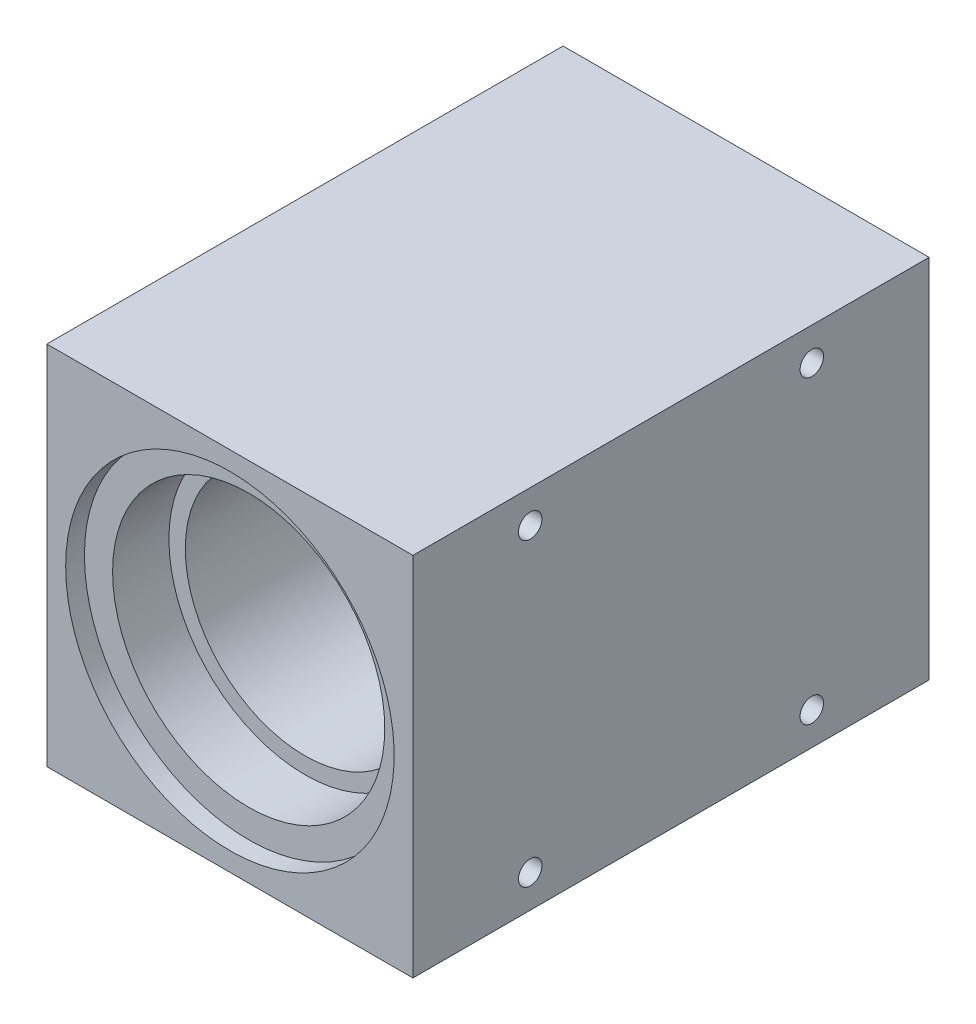
ISO-10303-21;
HEADER;
FILE_DESCRIPTION(('STEP AP214'),'2;1');
FILE_NAME('part.step','',(''),(''),'','','');
FILE_SCHEMA(('AUTOMOTIVE_DESIGN { 1 0 10303 214 1 1 1 1 }'));
ENDSEC;
DATA;
#1=APPLICATION_CONTEXT('core data for automotive mechanical design processes');
#2=APPLICATION_PROTOCOL_DEFINITION('international standard','automotive_design',2000,#1);
#3=PRODUCT_CONTEXT('',#1,'mechanical');
#4=PRODUCT('Part','Part','',(#3));
#5=PRODUCT_RELATED_PRODUCT_CATEGORY('part','',(#4));
#6=PRODUCT_DEFINITION_FORMATION('','',#4);
#7=PRODUCT_DEFINITION_CONTEXT('part definition',#1,'design');
#8=PRODUCT_DEFINITION('design','',#6,#7);
#9=PRODUCT_DEFINITION_SHAPE('','',#8);
#10=(LENGTH_UNIT() NAMED_UNIT(*) SI_UNIT(.MILLI.,.METRE.));
#11=(NAMED_UNIT(*) PLANE_ANGLE_UNIT() SI_UNIT($,.RADIAN.));
#12=(NAMED_UNIT(*) SI_UNIT($,.STERADIAN.) SOLID_ANGLE_UNIT());
#13=UNCERTAINTY_MEASURE_WITH_UNIT(LENGTH_MEASURE(1.E-05),#10,'distance_accuracy_value','');
#14=(GEOMETRIC_REPRESENTATION_CONTEXT(3) GLOBAL_UNCERTAINTY_ASSIGNED_CONTEXT((#13)) GLOBAL_UNIT_ASSIGNED_CONTEXT((#10,
#11,#12)) REPRESENTATION_CONTEXT('',''));
#15=CARTESIAN_POINT('',(0.,0.,0.));
#16=DIRECTION('',(0.,0.,1.));
#17=DIRECTION('',(1.,0.,0.));
#18=AXIS2_PLACEMENT_3D('',#15,#16,#17);
#19=CARTESIAN_POINT('',(0.,0.,110.));
#20=DIRECTION('',(0.,0.,-1.));
#21=DIRECTION('',(-1.,0.,0.));
#22=AXIS2_PLACEMENT_3D('',#19,#20,#21);
#23=CYLINDRICAL_SURFACE('',#22,25.5);
#24=CARTESIAN_POINT('',(0.,0.,16.));
#25=DIRECTION('',(0.,0.,-1.));
#26=DIRECTION('',(-1.,0.,0.));
#27=AXIS2_PLACEMENT_3D('',#24,#25,#26);
#28=CIRCLE('',#27,25.5);
#29=CARTESIAN_POINT('',(-25.5,0.,16.));
#30=VERTEX_POINT('',#29);
#31=EDGE_CURVE('E104',#30,#30,#28,.T.);
#32=ORIENTED_EDGE('',*,*,#31,.T.);
#33=EDGE_LOOP('',(#32));
#34=FACE_BOUND('',#33,.T.);
#35=CARTESIAN_POINT('',(0.,0.,94.));
#36=DIRECTION('',(0.,0.,1.));
#37=DIRECTION('',(1.,0.,0.));
#38=AXIS2_PLACEMENT_3D('',#35,#36,#37);
#39=CIRCLE('',#38,25.5);
#40=CARTESIAN_POINT('',(25.5,0.,94.));
#41=VERTEX_POINT('',#40);
#42=EDGE_CURVE('E38',#41,#41,#39,.T.);
#43=ORIENTED_EDGE('',*,*,#42,.T.);
#44=EDGE_LOOP('',(#43));
#45=FACE_BOUND('',#44,.T.);
#46=ADVANCED_FACE('F34',(#34,#45),#23,.F.);
#47=CARTESIAN_POINT('',(0.,0.,110.));
#48=DIRECTION('',(0.,0.,1.));
#49=DIRECTION('',(1.,0.,0.));
#50=AXIS2_PLACEMENT_3D('',#47,#48,#49);
#51=PLANE('',#50);
#52=CARTESIAN_POINT('',(0.,0.,110.));
#53=DIRECTION('',(0.,0.,-1.));
#54=DIRECTION('',(-1.,0.,0.));
#55=AXIS2_PLACEMENT_3D('',#52,#53,#54);
#56=CIRCLE('',#55,35.);
#57=CARTESIAN_POINT('',(-35.,0.,110.));
#58=VERTEX_POINT('',#57);
#59=EDGE_CURVE('E135',#58,#58,#56,.T.);
#60=ORIENTED_EDGE('',*,*,#59,.T.);
#61=EDGE_LOOP('',(#60));
#62=FACE_BOUND('',#61,.T.);
#63=DIRECTION('',(0.,1.,0.));
#64=VECTOR('',#63,1.);
#65=CARTESIAN_POINT('',(39.,39.,110.));
#66=LINE('',#65,#64);
#67=CARTESIAN_POINT('',(39.,-39.,110.));
#68=VERTEX_POINT('',#67);
#69=CARTESIAN_POINT('',(39.,39.,110.));
#70=VERTEX_POINT('',#69);
#71=EDGE_CURVE('E88',#68,#70,#66,.T.);
#72=ORIENTED_EDGE('',*,*,#71,.T.);
#73=DIRECTION('',(-1.,0.,0.));
#74=VECTOR('',#73,1.);
#75=CARTESIAN_POINT('',(-39.,39.,110.));
#76=LINE('',#75,#74);
#77=CARTESIAN_POINT('',(-39.,39.,110.));
#78=VERTEX_POINT('',#77);
#79=EDGE_CURVE('E83',#70,#78,#76,.T.);
#80=ORIENTED_EDGE('',*,*,#79,.T.);
#81=DIRECTION('',(0.,-1.,0.));
#82=VECTOR('',#81,1.);
#83=CARTESIAN_POINT('',(-39.,39.,110.));
#84=LINE('',#83,#82);
#85=CARTESIAN_POINT('',(-39.,-39.,110.));
#86=VERTEX_POINT('',#85);
#87=EDGE_CURVE('E86',#78,#86,#84,.T.);
#88=ORIENTED_EDGE('',*,*,#87,.T.);
#89=DIRECTION('',(1.,0.,0.));
#90=VECTOR('',#89,1.);
#91=CARTESIAN_POINT('',(-39.,-39.,110.));
#92=LINE('',#91,#90);
#93=EDGE_CURVE('E53',#86,#68,#92,.T.);
#94=ORIENTED_EDGE('',*,*,#93,.T.);
#95=EDGE_LOOP('',(#72,#80,#88,#94));
#96=FACE_BOUND('',#95,.T.);
#97=ADVANCED_FACE('F84',(#62,#96),#51,.T.);
#98=CARTESIAN_POINT('',(0.,0.,0.));
#99=DIRECTION('',(0.,0.,1.));
#100=DIRECTION('',(1.,0.,0.));
#101=AXIS2_PLACEMENT_3D('',#98,#99,#100);
#102=PLANE('',#101);
#103=CARTESIAN_POINT('',(0.,0.,0.));
#104=DIRECTION('',(0.,0.,1.));
#105=DIRECTION('',(1.,0.,0.));
#106=AXIS2_PLACEMENT_3D('',#103,#104,#105);
#107=CIRCLE('',#106,35.);
#108=CARTESIAN_POINT('',(35.,0.,0.));
#109=VERTEX_POINT('',#108);
#110=EDGE_CURVE('E126',#109,#109,#107,.T.);
#111=ORIENTED_EDGE('',*,*,#110,.T.);
#112=EDGE_LOOP('',(#111));
#113=FACE_BOUND('',#112,.T.);
#114=DIRECTION('',(0.,1.,0.));
#115=VECTOR('',#114,1.);
#116=CARTESIAN_POINT('',(39.,39.,0.));
#117=LINE('',#116,#115);
#118=CARTESIAN_POINT('',(39.,-39.,0.));
#119=VERTEX_POINT('',#118);
#120=CARTESIAN_POINT('',(39.,39.,0.));
#121=VERTEX_POINT('',#120);
#122=EDGE_CURVE('E101',#119,#121,#117,.T.);
#123=ORIENTED_EDGE('',*,*,#122,.F.);
#124=DIRECTION('',(1.,0.,0.));
#125=VECTOR('',#124,1.);
#126=CARTESIAN_POINT('',(-39.,-39.,0.));
#127=LINE('',#126,#125);
#128=CARTESIAN_POINT('',(-39.,-39.,0.));
#129=VERTEX_POINT('',#128);
#130=EDGE_CURVE('E76',#129,#119,#127,.T.);
#131=ORIENTED_EDGE('',*,*,#130,.F.);
#132=DIRECTION('',(0.,-1.,0.));
#133=VECTOR('',#132,1.);
#134=CARTESIAN_POINT('',(-39.,39.,0.));
#135=LINE('',#134,#133);
#136=CARTESIAN_POINT('',(-39.,39.,0.));
#137=VERTEX_POINT('',#136);
#138=EDGE_CURVE('E70',#137,#129,#135,.T.);
#139=ORIENTED_EDGE('',*,*,#138,.F.);
#140=DIRECTION('',(-1.,0.,0.));
#141=VECTOR('',#140,1.);
#142=CARTESIAN_POINT('',(-39.,39.,0.));
#143=LINE('',#142,#141);
#144=EDGE_CURVE('E92',#121,#137,#143,.T.);
#145=ORIENTED_EDGE('',*,*,#144,.F.);
#146=EDGE_LOOP('',(#123,#131,#139,#145));
#147=FACE_BOUND('',#146,.T.);
#148=ADVANCED_FACE('F177',(#113,#147),#102,.F.);
#149=CARTESIAN_POINT('',(39.,39.,110.));
#150=DIRECTION('',(-1.,0.,0.));
#151=DIRECTION('',(0.,-1.,0.));
#152=AXIS2_PLACEMENT_3D('',#149,#150,#151);
#153=PLANE('',#152);
#154=CARTESIAN_POINT('',(39.,-32.,85.));
#155=DIRECTION('',(1.,0.,0.));
#156=DIRECTION('',(0.,1.,0.));
#157=AXIS2_PLACEMENT_3D('',#154,#155,#156);
#158=CIRCLE('',#157,2.5);
#159=CARTESIAN_POINT('',(39.,-29.5,85.));
#160=VERTEX_POINT('',#159);
#161=EDGE_CURVE('E147',#160,#160,#158,.T.);
#162=ORIENTED_EDGE('',*,*,#161,.F.);
#163=EDGE_LOOP('',(#162));
#164=FACE_BOUND('',#163,.T.);
#165=CARTESIAN_POINT('',(39.,-32.,25.));
#166=DIRECTION('',(1.,0.,0.));
#167=DIRECTION('',(0.,1.,0.));
#168=AXIS2_PLACEMENT_3D('',#165,#166,#167);
#169=CIRCLE('',#168,2.5);
#170=CARTESIAN_POINT('',(39.,-29.5,25.));
#171=VERTEX_POINT('',#170);
#172=EDGE_CURVE('E153',#171,#171,#169,.T.);
#173=ORIENTED_EDGE('',*,*,#172,.F.);
#174=EDGE_LOOP('',(#173));
#175=FACE_BOUND('',#174,.T.);
#176=CARTESIAN_POINT('',(39.,32.,25.));
#177=DIRECTION('',(1.,0.,0.));
#178=DIRECTION('',(0.,1.,0.));
#179=AXIS2_PLACEMENT_3D('',#176,#177,#178);
#180=CIRCLE('',#179,2.5);
#181=CARTESIAN_POINT('',(39.,34.5,25.));
#182=VERTEX_POINT('',#181);
#183=EDGE_CURVE('E159',#182,#182,#180,.T.);
#184=ORIENTED_EDGE('',*,*,#183,.F.);
#185=EDGE_LOOP('',(#184));
#186=FACE_BOUND('',#185,.T.);
#187=CARTESIAN_POINT('',(39.,32.,85.));
#188=DIRECTION('',(1.,0.,0.));
#189=DIRECTION('',(0.,1.,0.));
#190=AXIS2_PLACEMENT_3D('',#187,#188,#189);
#191=CIRCLE('',#190,2.5);
#192=CARTESIAN_POINT('',(39.,34.5,85.));
#193=VERTEX_POINT('',#192);
#194=EDGE_CURVE('E141',#193,#193,#191,.T.);
#195=ORIENTED_EDGE('',*,*,#194,.F.);
#196=EDGE_LOOP('',(#195));
#197=FACE_BOUND('',#196,.T.);
#198=ORIENTED_EDGE('',*,*,#122,.T.);
#199=DIRECTION('',(0.,0.,-1.));
#200=VECTOR('',#199,1.);
#201=CARTESIAN_POINT('',(39.,39.,110.));
#202=LINE('',#201,#200);
#203=EDGE_CURVE('E11',#70,#121,#202,.T.);
#204=ORIENTED_EDGE('',*,*,#203,.F.);
#205=ORIENTED_EDGE('',*,*,#71,.F.);
#206=DIRECTION('',(0.,0.,-1.));
#207=VECTOR('',#206,1.);
#208=CARTESIAN_POINT('',(39.,-39.,110.));
#209=LINE('',#208,#207);
#210=EDGE_CURVE('E97',#68,#119,#209,.T.);
#211=ORIENTED_EDGE('',*,*,#210,.T.);
#212=EDGE_LOOP('',(#198,#204,#205,#211));
#213=FACE_BOUND('',#212,.T.);
#214=ADVANCED_FACE('F36',(#164,#175,#186,#197,#213),#153,.F.);
#215=CARTESIAN_POINT('',(-39.,39.,110.));
#216=DIRECTION('',(0.,-1.,0.));
#217=DIRECTION('',(0.,0.,-1.));
#218=AXIS2_PLACEMENT_3D('',#215,#216,#217);
#219=PLANE('',#218);
#220=ORIENTED_EDGE('',*,*,#144,.T.);
#221=DIRECTION('',(0.,0.,-1.));
#222=VECTOR('',#221,1.);
#223=CARTESIAN_POINT('',(-39.,39.,110.));
#224=LINE('',#223,#222);
#225=EDGE_CURVE('E44',#78,#137,#224,.T.);
#226=ORIENTED_EDGE('',*,*,#225,.F.);
#227=ORIENTED_EDGE('',*,*,#79,.F.);
#228=ORIENTED_EDGE('',*,*,#203,.T.);
#229=EDGE_LOOP('',(#220,#226,#227,#228));
#230=FACE_BOUND('',#229,.T.);
#231=ADVANCED_FACE('F91',(#230),#219,.F.);
#232=CARTESIAN_POINT('',(-39.,39.,110.));
#233=DIRECTION('',(1.,0.,0.));
#234=DIRECTION('',(0.,1.,0.));
#235=AXIS2_PLACEMENT_3D('',#232,#233,#234);
#236=PLANE('',#235);
#237=CARTESIAN_POINT('',(-39.,-32.,85.));
#238=DIRECTION('',(1.,0.,0.));
#239=DIRECTION('',(0.,1.,0.));
#240=AXIS2_PLACEMENT_3D('',#237,#238,#239);
#241=CIRCLE('',#240,2.5);
#242=CARTESIAN_POINT('',(-39.,-29.5,85.));
#243=VERTEX_POINT('',#242);
#244=EDGE_CURVE('E150',#243,#243,#241,.T.);
#245=ORIENTED_EDGE('',*,*,#244,.T.);
#246=EDGE_LOOP('',(#245));
#247=FACE_BOUND('',#246,.T.);
#248=CARTESIAN_POINT('',(-39.,-32.,25.));
#249=DIRECTION('',(1.,0.,0.));
#250=DIRECTION('',(0.,1.,0.));
#251=AXIS2_PLACEMENT_3D('',#248,#249,#250);
#252=CIRCLE('',#251,2.5);
#253=CARTESIAN_POINT('',(-39.,-29.5,25.));
#254=VERTEX_POINT('',#253);
#255=EDGE_CURVE('E156',#254,#254,#252,.T.);
#256=ORIENTED_EDGE('',*,*,#255,.T.);
#257=EDGE_LOOP('',(#256));
#258=FACE_BOUND('',#257,.T.);
#259=CARTESIAN_POINT('',(-39.,32.,25.));
#260=DIRECTION('',(1.,0.,0.));
#261=DIRECTION('',(0.,1.,0.));
#262=AXIS2_PLACEMENT_3D('',#259,#260,#261);
#263=CIRCLE('',#262,2.5);
#264=CARTESIAN_POINT('',(-39.,34.5,25.));
#265=VERTEX_POINT('',#264);
#266=EDGE_CURVE('E144',#265,#265,#263,.T.);
#267=ORIENTED_EDGE('',*,*,#266,.T.);
#268=EDGE_LOOP('',(#267));
#269=FACE_BOUND('',#268,.T.);
#270=CARTESIAN_POINT('',(-39.,32.,85.));
#271=DIRECTION('',(1.,0.,0.));
#272=DIRECTION('',(0.,1.,0.));
#273=AXIS2_PLACEMENT_3D('',#270,#271,#272);
#274=CIRCLE('',#273,2.5);
#275=CARTESIAN_POINT('',(-39.,34.5,85.));
#276=VERTEX_POINT('',#275);
#277=EDGE_CURVE('E138',#276,#276,#274,.T.);
#278=ORIENTED_EDGE('',*,*,#277,.T.);
#279=EDGE_LOOP('',(#278));
#280=FACE_BOUND('',#279,.T.);
#281=ORIENTED_EDGE('',*,*,#138,.T.);
#282=DIRECTION('',(0.,0.,-1.));
#283=VECTOR('',#282,1.);
#284=CARTESIAN_POINT('',(-39.,-39.,110.));
#285=LINE('',#284,#283);
#286=EDGE_CURVE('E93',#86,#129,#285,.T.);
#287=ORIENTED_EDGE('',*,*,#286,.F.);
#288=ORIENTED_EDGE('',*,*,#87,.F.);
#289=ORIENTED_EDGE('',*,*,#225,.T.);
#290=EDGE_LOOP('',(#281,#287,#288,#289));
#291=FACE_BOUND('',#290,.T.);
#292=ADVANCED_FACE('F95',(#247,#258,#269,#280,#291),#236,.F.);
#293=CARTESIAN_POINT('',(-39.,-39.,110.));
#294=DIRECTION('',(0.,1.,0.));
#295=DIRECTION('',(0.,0.,1.));
#296=AXIS2_PLACEMENT_3D('',#293,#294,#295);
#297=PLANE('',#296);
#298=ORIENTED_EDGE('',*,*,#130,.T.);
#299=ORIENTED_EDGE('',*,*,#210,.F.);
#300=ORIENTED_EDGE('',*,*,#93,.F.);
#301=ORIENTED_EDGE('',*,*,#286,.T.);
#302=EDGE_LOOP('',(#298,#299,#300,#301));
#303=FACE_BOUND('',#302,.T.);
#304=ADVANCED_FACE('F202',(#303),#297,.F.);
#305=CARTESIAN_POINT('',(0.,0.,16.));
#306=DIRECTION('',(0.,0.,-1.));
#307=DIRECTION('',(-1.,0.,0.));
#308=AXIS2_PLACEMENT_3D('',#305,#306,#307);
#309=CYLINDRICAL_SURFACE('',#308,29.);
#310=CARTESIAN_POINT('',(0.,0.,16.));
#311=DIRECTION('',(0.,0.,-1.));
#312=DIRECTION('',(-1.,0.,0.));
#313=AXIS2_PLACEMENT_3D('',#310,#311,#312);
#314=CIRCLE('',#313,29.);
#315=CARTESIAN_POINT('',(-29.,0.,16.));
#316=VERTEX_POINT('',#315);
#317=EDGE_CURVE('E110',#316,#316,#314,.T.);
#318=ORIENTED_EDGE('',*,*,#317,.F.);
#319=EDGE_LOOP('',(#318));
#320=FACE_BOUND('',#319,.T.);
#321=CARTESIAN_POINT('',(0.,0.,4.));
#322=DIRECTION('',(0.,0.,1.));
#323=DIRECTION('',(1.,0.,0.));
#324=AXIS2_PLACEMENT_3D('',#321,#322,#323);
#325=CIRCLE('',#324,29.);
#326=CARTESIAN_POINT('',(29.,0.,4.));
#327=VERTEX_POINT('',#326);
#328=EDGE_CURVE('E122',#327,#327,#325,.F.);
#329=ORIENTED_EDGE('',*,*,#328,.T.);
#330=EDGE_LOOP('',(#329));
#331=FACE_BOUND('',#330,.T.);
#332=ADVANCED_FACE('F198',(#320,#331),#309,.F.);
#333=CARTESIAN_POINT('',(0.,0.,16.));
#334=DIRECTION('',(0.,0.,-1.));
#335=DIRECTION('',(-1.,0.,0.));
#336=AXIS2_PLACEMENT_3D('',#333,#334,#335);
#337=PLANE('',#336);
#338=ORIENTED_EDGE('',*,*,#31,.F.);
#339=EDGE_LOOP('',(#338));
#340=FACE_BOUND('',#339,.T.);
#341=ORIENTED_EDGE('',*,*,#317,.T.);
#342=EDGE_LOOP('',(#341));
#343=FACE_BOUND('',#342,.T.);
#344=ADVANCED_FACE('F201',(#340,#343),#337,.T.);
#345=CARTESIAN_POINT('',(0.,0.,94.));
#346=DIRECTION('',(0.,0.,1.));
#347=DIRECTION('',(1.,0.,0.));
#348=AXIS2_PLACEMENT_3D('',#345,#346,#347);
#349=CYLINDRICAL_SURFACE('',#348,29.);
#350=CARTESIAN_POINT('',(0.,0.,94.));
#351=DIRECTION('',(0.,0.,1.));
#352=DIRECTION('',(1.,0.,0.));
#353=AXIS2_PLACEMENT_3D('',#350,#351,#352);
#354=CIRCLE('',#353,29.);
#355=CARTESIAN_POINT('',(29.,0.,94.));
#356=VERTEX_POINT('',#355);
#357=EDGE_CURVE('E118',#356,#356,#354,.T.);
#358=ORIENTED_EDGE('',*,*,#357,.F.);
#359=EDGE_LOOP('',(#358));
#360=FACE_BOUND('',#359,.T.);
#361=CARTESIAN_POINT('',(0.,0.,106.));
#362=DIRECTION('',(0.,0.,-1.));
#363=DIRECTION('',(-1.,0.,0.));
#364=AXIS2_PLACEMENT_3D('',#361,#362,#363);
#365=CIRCLE('',#364,29.);
#366=CARTESIAN_POINT('',(-29.,0.,106.));
#367=VERTEX_POINT('',#366);
#368=EDGE_CURVE('E129',#367,#367,#365,.F.);
#369=ORIENTED_EDGE('',*,*,#368,.T.);
#370=EDGE_LOOP('',(#369));
#371=FACE_BOUND('',#370,.T.);
#372=ADVANCED_FACE('F206',(#360,#371),#349,.F.);
#373=CARTESIAN_POINT('',(0.,0.,94.));
#374=DIRECTION('',(0.,0.,1.));
#375=DIRECTION('',(1.,0.,0.));
#376=AXIS2_PLACEMENT_3D('',#373,#374,#375);
#377=PLANE('',#376);
#378=ORIENTED_EDGE('',*,*,#42,.F.);
#379=EDGE_LOOP('',(#378));
#380=FACE_BOUND('',#379,.T.);
#381=ORIENTED_EDGE('',*,*,#357,.T.);
#382=EDGE_LOOP('',(#381));
#383=FACE_BOUND('',#382,.T.);
#384=ADVANCED_FACE('F210',(#380,#383),#377,.T.);
#385=CARTESIAN_POINT('',(0.,0.,4.));
#386=DIRECTION('',(0.,0.,1.));
#387=DIRECTION('',(1.,0.,0.));
#388=AXIS2_PLACEMENT_3D('',#385,#386,#387);
#389=PLANE('',#388);
#390=CARTESIAN_POINT('',(0.,0.,4.));
#391=DIRECTION('',(0.,0.,1.));
#392=DIRECTION('',(1.,0.,0.));
#393=AXIS2_PLACEMENT_3D('',#390,#391,#392);
#394=CIRCLE('',#393,35.);
#395=CARTESIAN_POINT('',(35.,0.,4.));
#396=VERTEX_POINT('',#395);
#397=EDGE_CURVE('E125',#396,#396,#394,.T.);
#398=ORIENTED_EDGE('',*,*,#397,.F.);
#399=EDGE_LOOP('',(#398));
#400=FACE_BOUND('',#399,.T.);
#401=ORIENTED_EDGE('',*,*,#328,.F.);
#402=EDGE_LOOP('',(#401));
#403=FACE_BOUND('',#402,.T.);
#404=ADVANCED_FACE('F214',(#400,#403),#389,.F.);
#405=CARTESIAN_POINT('',(0.,0.,4.));
#406=DIRECTION('',(0.,0.,-1.));
#407=DIRECTION('',(-1.,0.,0.));
#408=AXIS2_PLACEMENT_3D('',#405,#406,#407);
#409=CYLINDRICAL_SURFACE('',#408,35.);
#410=ORIENTED_EDGE('',*,*,#397,.T.);
#411=EDGE_LOOP('',(#410));
#412=FACE_BOUND('',#411,.T.);
#413=ORIENTED_EDGE('',*,*,#110,.F.);
#414=EDGE_LOOP('',(#413));
#415=FACE_BOUND('',#414,.T.);
#416=ADVANCED_FACE('F216',(#412,#415),#409,.F.);
#417=CARTESIAN_POINT('',(0.,0.,106.));
#418=DIRECTION('',(0.,0.,-1.));
#419=DIRECTION('',(-1.,0.,0.));
#420=AXIS2_PLACEMENT_3D('',#417,#418,#419);
#421=PLANE('',#420);
#422=CARTESIAN_POINT('',(0.,0.,106.));
#423=DIRECTION('',(0.,0.,-1.));
#424=DIRECTION('',(-1.,0.,0.));
#425=AXIS2_PLACEMENT_3D('',#422,#423,#424);
#426=CIRCLE('',#425,35.);
#427=CARTESIAN_POINT('',(-35.,0.,106.));
#428=VERTEX_POINT('',#427);
#429=EDGE_CURVE('E134',#428,#428,#426,.T.);
#430=ORIENTED_EDGE('',*,*,#429,.F.);
#431=EDGE_LOOP('',(#430));
#432=FACE_BOUND('',#431,.T.);
#433=ORIENTED_EDGE('',*,*,#368,.F.);
#434=EDGE_LOOP('',(#433));
#435=FACE_BOUND('',#434,.T.);
#436=ADVANCED_FACE('F219',(#432,#435),#421,.F.);
#437=CARTESIAN_POINT('',(0.,0.,106.));
#438=DIRECTION('',(0.,0.,1.));
#439=DIRECTION('',(1.,0.,0.));
#440=AXIS2_PLACEMENT_3D('',#437,#438,#439);
#441=CYLINDRICAL_SURFACE('',#440,35.);
#442=ORIENTED_EDGE('',*,*,#429,.T.);
#443=EDGE_LOOP('',(#442));
#444=FACE_BOUND('',#443,.T.);
#445=ORIENTED_EDGE('',*,*,#59,.F.);
#446=EDGE_LOOP('',(#445));
#447=FACE_BOUND('',#446,.T.);
#448=ADVANCED_FACE('F224',(#444,#447),#441,.F.);
#449=CARTESIAN_POINT('',(-39.,32.,85.));
#450=DIRECTION('',(1.,0.,0.));
#451=DIRECTION('',(0.,1.,0.));
#452=AXIS2_PLACEMENT_3D('',#449,#450,#451);
#453=CYLINDRICAL_SURFACE('',#452,2.5);
#454=ORIENTED_EDGE('',*,*,#277,.F.);
#455=EDGE_LOOP('',(#454));
#456=FACE_BOUND('',#455,.T.);
#457=ORIENTED_EDGE('',*,*,#194,.T.);
#458=EDGE_LOOP('',(#457));
#459=FACE_BOUND('',#458,.T.);
#460=ADVANCED_FACE('F171',(#456,#459),#453,.F.);
#461=CARTESIAN_POINT('',(-39.,32.,25.));
#462=DIRECTION('',(1.,0.,0.));
#463=DIRECTION('',(0.,1.,0.));
#464=AXIS2_PLACEMENT_3D('',#461,#462,#463);
#465=CYLINDRICAL_SURFACE('',#464,2.5);
#466=ORIENTED_EDGE('',*,*,#266,.F.);
#467=EDGE_LOOP('',(#466));
#468=FACE_BOUND('',#467,.T.);
#469=ORIENTED_EDGE('',*,*,#183,.T.);
#470=EDGE_LOOP('',(#469));
#471=FACE_BOUND('',#470,.T.);
#472=ADVANCED_FACE('F167',(#468,#471),#465,.F.);
#473=CARTESIAN_POINT('',(-39.,-32.,25.));
#474=DIRECTION('',(1.,0.,0.));
#475=DIRECTION('',(0.,1.,0.));
#476=AXIS2_PLACEMENT_3D('',#473,#474,#475);
#477=CYLINDRICAL_SURFACE('',#476,2.5);
#478=ORIENTED_EDGE('',*,*,#255,.F.);
#479=EDGE_LOOP('',(#478));
#480=FACE_BOUND('',#479,.T.);
#481=ORIENTED_EDGE('',*,*,#172,.T.);
#482=EDGE_LOOP('',(#481));
#483=FACE_BOUND('',#482,.T.);
#484=ADVANCED_FACE('F170',(#480,#483),#477,.F.);
#485=CARTESIAN_POINT('',(-39.,-32.,85.));
#486=DIRECTION('',(1.,0.,0.));
#487=DIRECTION('',(0.,1.,0.));
#488=AXIS2_PLACEMENT_3D('',#485,#486,#487);
#489=CYLINDRICAL_SURFACE('',#488,2.5);
#490=ORIENTED_EDGE('',*,*,#244,.F.);
#491=EDGE_LOOP('',(#490));
#492=FACE_BOUND('',#491,.T.);
#493=ORIENTED_EDGE('',*,*,#161,.T.);
#494=EDGE_LOOP('',(#493));
#495=FACE_BOUND('',#494,.T.);
#496=ADVANCED_FACE('F234',(#492,#495),#489,.F.);
#497=CLOSED_SHELL('',(#46,#97,#148,#214,#231,#292,#304,#332,#344,#372,#384,#404,#416,#436,#448,
#460,#472,#484,#496));
#498=MANIFOLD_SOLID_BREP('B2',#497);
#499=ADVANCED_BREP_SHAPE_REPRESENTATION('',(#18,#498),#14);
#500=SHAPE_DEFINITION_REPRESENTATION(#9,#499);
ENDSEC;
END-ISO-10303-21;
